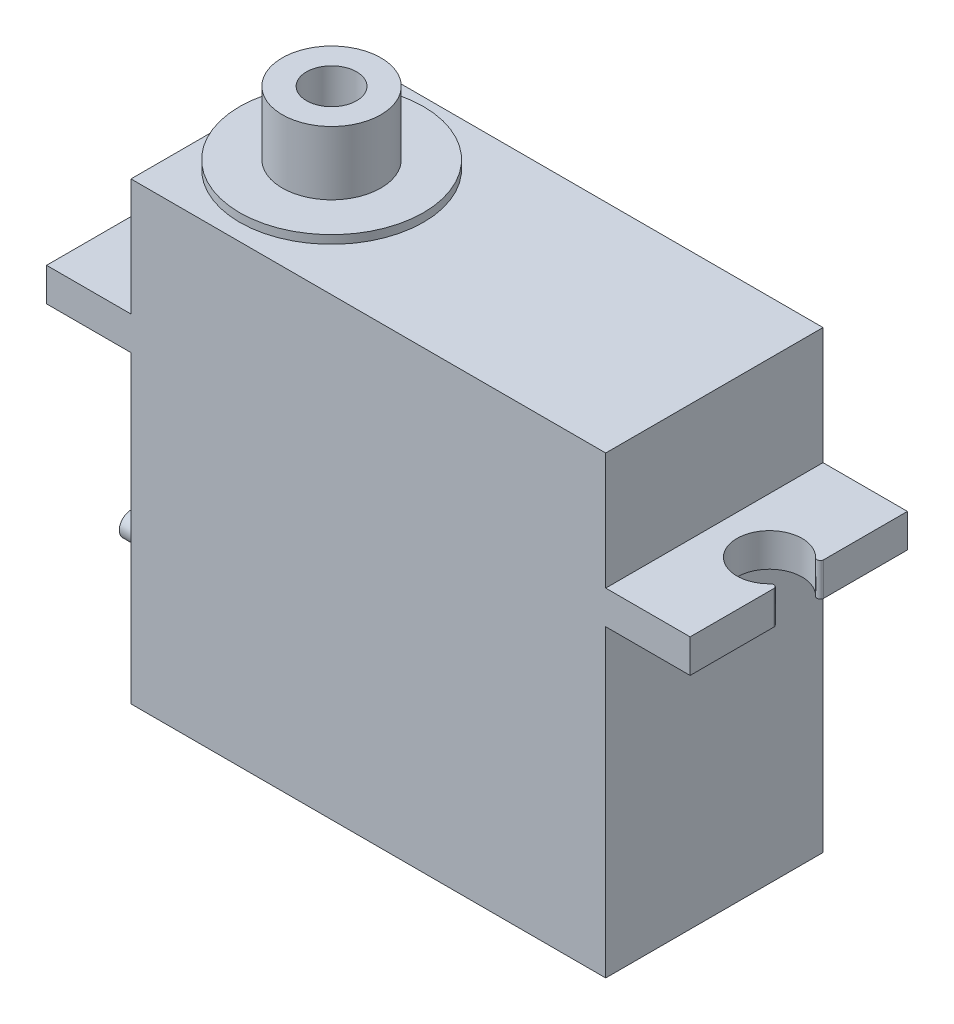
ISO-10303-21;
HEADER;
FILE_DESCRIPTION(('STEP AP214'),'2;1');
FILE_NAME('part.step','',(''),(''),'','','');
FILE_SCHEMA(('AUTOMOTIVE_DESIGN { 1 0 10303 214 1 1 1 1 }'));
ENDSEC;
DATA;
#1=APPLICATION_CONTEXT('core data for automotive mechanical design processes');
#2=APPLICATION_PROTOCOL_DEFINITION('international standard','automotive_design',2000,#1);
#3=PRODUCT_CONTEXT('',#1,'mechanical');
#4=PRODUCT('Part','Part','',(#3));
#5=PRODUCT_RELATED_PRODUCT_CATEGORY('part','',(#4));
#6=PRODUCT_DEFINITION_FORMATION('','',#4);
#7=PRODUCT_DEFINITION_CONTEXT('part definition',#1,'design');
#8=PRODUCT_DEFINITION('design','',#6,#7);
#9=PRODUCT_DEFINITION_SHAPE('','',#8);
#10=(LENGTH_UNIT() NAMED_UNIT(*) SI_UNIT(.MILLI.,.METRE.));
#11=(NAMED_UNIT(*) PLANE_ANGLE_UNIT() SI_UNIT($,.RADIAN.));
#12=(NAMED_UNIT(*) SI_UNIT($,.STERADIAN.) SOLID_ANGLE_UNIT());
#13=UNCERTAINTY_MEASURE_WITH_UNIT(LENGTH_MEASURE(1.E-05),#10,'distance_accuracy_value','');
#14=(GEOMETRIC_REPRESENTATION_CONTEXT(3) GLOBAL_UNCERTAINTY_ASSIGNED_CONTEXT((#13)) GLOBAL_UNIT_ASSIGNED_CONTEXT((#10,
#11,#12)) REPRESENTATION_CONTEXT('',''));
#15=CARTESIAN_POINT('',(0.,0.,0.));
#16=DIRECTION('',(0.,0.,1.));
#17=DIRECTION('',(1.,0.,0.));
#18=AXIS2_PLACEMENT_3D('',#15,#16,#17);
#19=CARTESIAN_POINT('',(-14.2,0.,6.5));
#20=DIRECTION('',(1.,0.,0.));
#21=DIRECTION('',(0.,1.,0.));
#22=AXIS2_PLACEMENT_3D('',#19,#20,#21);
#23=PLANE('',#22);
#24=DIRECTION('',(0.,-1.,0.));
#25=VECTOR('',#24,1.);
#26=CARTESIAN_POINT('',(-14.2,0.,-6.5));
#27=LINE('',#26,#25);
#28=CARTESIAN_POINT('',(-14.2,0.,-6.5));
#29=VERTEX_POINT('',#28);
#30=CARTESIAN_POINT('',(-14.2,-18.2,-6.5));
#31=VERTEX_POINT('',#30);
#32=EDGE_CURVE('E293',#29,#31,#27,.T.);
#33=ORIENTED_EDGE('',*,*,#32,.T.);
#34=DIRECTION('',(0.,0.,-1.));
#35=VECTOR('',#34,1.);
#36=CARTESIAN_POINT('',(-14.2,-18.2,6.5));
#37=LINE('',#36,#35);
#38=CARTESIAN_POINT('',(-14.2,-18.2,6.5));
#39=VERTEX_POINT('',#38);
#40=EDGE_CURVE('E336',#39,#31,#37,.T.);
#41=ORIENTED_EDGE('',*,*,#40,.F.);
#42=DIRECTION('',(0.,-1.,0.));
#43=VECTOR('',#42,1.);
#44=CARTESIAN_POINT('',(-14.2,0.,6.5));
#45=LINE('',#44,#43);
#46=CARTESIAN_POINT('',(-14.2,0.,6.5));
#47=VERTEX_POINT('',#46);
#48=EDGE_CURVE('E265',#47,#39,#45,.T.);
#49=ORIENTED_EDGE('',*,*,#48,.F.);
#50=DIRECTION('',(0.,0.,-1.));
#51=VECTOR('',#50,1.);
#52=CARTESIAN_POINT('',(-14.2,0.,6.5));
#53=LINE('',#52,#51);
#54=EDGE_CURVE('E339',#47,#29,#53,.T.);
#55=ORIENTED_EDGE('',*,*,#54,.T.);
#56=EDGE_LOOP('',(#33,#41,#49,#55));
#57=FACE_BOUND('',#56,.T.);
#58=DIRECTION('',(0.,-1.,0.));
#59=VECTOR('',#58,1.);
#60=CARTESIAN_POINT('',(-14.2,-12.,-3.1));
#61=LINE('',#60,#59);
#62=CARTESIAN_POINT('',(-14.2,-12.,-3.1));
#63=VERTEX_POINT('',#62);
#64=CARTESIAN_POINT('',(-14.2,-15.7,-3.1));
#65=VERTEX_POINT('',#64);
#66=EDGE_CURVE('E226',#63,#65,#61,.T.);
#67=ORIENTED_EDGE('',*,*,#66,.F.);
#68=DIRECTION('',(0.,0.,-1.));
#69=VECTOR('',#68,1.);
#70=CARTESIAN_POINT('',(-14.2,-12.,-3.1));
#71=LINE('',#70,#69);
#72=CARTESIAN_POINT('',(-14.2,-12.,3.1));
#73=VERTEX_POINT('',#72);
#74=EDGE_CURVE('E223',#73,#63,#71,.T.);
#75=ORIENTED_EDGE('',*,*,#74,.F.);
#76=DIRECTION('',(0.,1.,0.));
#77=VECTOR('',#76,1.);
#78=CARTESIAN_POINT('',(-14.2,-12.,3.1));
#79=LINE('',#78,#77);
#80=CARTESIAN_POINT('',(-14.2,-15.7,3.1));
#81=VERTEX_POINT('',#80);
#82=EDGE_CURVE('E59',#81,#73,#79,.T.);
#83=ORIENTED_EDGE('',*,*,#82,.F.);
#84=DIRECTION('',(0.,0.,1.));
#85=VECTOR('',#84,1.);
#86=CARTESIAN_POINT('',(-14.2,-15.7,-3.1));
#87=LINE('',#86,#85);
#88=EDGE_CURVE('E54',#65,#81,#87,.T.);
#89=ORIENTED_EDGE('',*,*,#88,.F.);
#90=EDGE_LOOP('',(#67,#75,#83,#89));
#91=FACE_BOUND('',#90,.T.);
#92=ADVANCED_FACE('F37',(#57,#91),#23,.F.);
#93=CARTESIAN_POINT('',(-19.25,0.,6.5));
#94=DIRECTION('',(1.,0.,0.));
#95=DIRECTION('',(0.,0.,-1.));
#96=AXIS2_PLACEMENT_3D('',#93,#94,#95);
#97=PLANE('',#96);
#98=DIRECTION('',(0.,0.,-1.));
#99=VECTOR('',#98,1.);
#100=CARTESIAN_POINT('',(-19.25,0.,6.5));
#101=LINE('',#100,#99);
#102=CARTESIAN_POINT('',(-19.25,0.,-1.48996644257513));
#103=VERTEX_POINT('',#102);
#104=CARTESIAN_POINT('',(-19.25,0.,-6.5));
#105=VERTEX_POINT('',#104);
#106=EDGE_CURVE('E341',#103,#105,#101,.T.);
#107=ORIENTED_EDGE('',*,*,#106,.F.);
#108=DIRECTION('',(0.,1.,0.));
#109=VECTOR('',#108,1.);
#110=CARTESIAN_POINT('',(-19.25,0.,-1.48996644257513));
#111=LINE('',#110,#109);
#112=CARTESIAN_POINT('',(-19.25,2.,-1.48996644257513));
#113=VERTEX_POINT('',#112);
#114=EDGE_CURVE('E41',#103,#113,#111,.T.);
#115=ORIENTED_EDGE('',*,*,#114,.T.);
#116=DIRECTION('',(0.,0.,-1.));
#117=VECTOR('',#116,1.);
#118=CARTESIAN_POINT('',(-19.25,2.,6.5));
#119=LINE('',#118,#117);
#120=CARTESIAN_POINT('',(-19.25,2.,-6.5));
#121=VERTEX_POINT('',#120);
#122=EDGE_CURVE('E345',#113,#121,#119,.T.);
#123=ORIENTED_EDGE('',*,*,#122,.T.);
#124=DIRECTION('',(0.,-1.,0.));
#125=VECTOR('',#124,1.);
#126=CARTESIAN_POINT('',(-19.25,0.,-6.5));
#127=LINE('',#126,#125);
#128=EDGE_CURVE('E287',#121,#105,#127,.T.);
#129=ORIENTED_EDGE('',*,*,#128,.T.);
#130=EDGE_LOOP('',(#107,#115,#123,#129));
#131=FACE_BOUND('',#130,.T.);
#132=ADVANCED_FACE('F395',(#131),#97,.F.);
#133=CARTESIAN_POINT('',(19.25,0.,6.5));
#134=DIRECTION('',(1.,0.,0.));
#135=DIRECTION('',(0.,0.,-1.));
#136=AXIS2_PLACEMENT_3D('',#133,#134,#135);
#137=PLANE('',#136);
#138=DIRECTION('',(0.,0.,-1.));
#139=VECTOR('',#138,1.);
#140=CARTESIAN_POINT('',(19.25,2.,6.5));
#141=LINE('',#140,#139);
#142=CARTESIAN_POINT('',(19.25,2.,-1.48996644257513));
#143=VERTEX_POINT('',#142);
#144=CARTESIAN_POINT('',(19.25,2.,-6.5));
#145=VERTEX_POINT('',#144);
#146=EDGE_CURVE('E324',#143,#145,#141,.T.);
#147=ORIENTED_EDGE('',*,*,#146,.F.);
#148=DIRECTION('',(0.,-1.,0.));
#149=VECTOR('',#148,1.);
#150=CARTESIAN_POINT('',(19.25,0.,-1.48996644257514));
#151=LINE('',#150,#149);
#152=CARTESIAN_POINT('',(19.25,0.,-1.48996644257513));
#153=VERTEX_POINT('',#152);
#154=EDGE_CURVE('E371',#143,#153,#151,.T.);
#155=ORIENTED_EDGE('',*,*,#154,.T.);
#156=DIRECTION('',(0.,0.,-1.));
#157=VECTOR('',#156,1.);
#158=CARTESIAN_POINT('',(19.25,0.,6.5));
#159=LINE('',#158,#157);
#160=CARTESIAN_POINT('',(19.25,0.,-6.5));
#161=VERTEX_POINT('',#160);
#162=EDGE_CURVE('E328',#153,#161,#159,.T.);
#163=ORIENTED_EDGE('',*,*,#162,.T.);
#164=DIRECTION('',(0.,-1.,0.));
#165=VECTOR('',#164,1.);
#166=CARTESIAN_POINT('',(19.25,0.,-6.5));
#167=LINE('',#166,#165);
#168=EDGE_CURVE('E305',#145,#161,#167,.T.);
#169=ORIENTED_EDGE('',*,*,#168,.F.);
#170=EDGE_LOOP('',(#147,#155,#163,#169));
#171=FACE_BOUND('',#170,.T.);
#172=ADVANCED_FACE('F451',(#171),#137,.T.);
#173=CARTESIAN_POINT('',(0.,2.,6.5));
#174=DIRECTION('',(0.,-1.,0.));
#175=DIRECTION('',(1.,0.,0.));
#176=AXIS2_PLACEMENT_3D('',#173,#174,#175);
#177=PLANE('',#176);
#178=CARTESIAN_POINT('',(-17.5,2.,0.));
#179=DIRECTION('',(0.,1.,0.));
#180=DIRECTION('',(0.,0.,1.));
#181=AXIS2_PLACEMENT_3D('',#178,#179,#180);
#182=CIRCLE('',#181,1.95);
#183=CARTESIAN_POINT('',(-18.9058139534884,2.,1.35136491303326));
#184=VERTEX_POINT('',#183);
#185=CARTESIAN_POINT('',(-18.9058139534884,2.,-1.35136491303326));
#186=VERTEX_POINT('',#185);
#187=EDGE_CURVE('E247',#184,#186,#182,.T.);
#188=ORIENTED_EDGE('',*,*,#187,.F.);
#189=CARTESIAN_POINT('',(-19.05,2.,1.48996644257514));
#190=DIRECTION('',(0.,-1.,0.));
#191=DIRECTION('',(1.,0.,0.));
#192=AXIS2_PLACEMENT_3D('',#189,#190,#191);
#193=CIRCLE('',#192,0.2);
#194=CARTESIAN_POINT('',(-19.25,2.,1.48996644257514));
#195=VERTEX_POINT('',#194);
#196=EDGE_CURVE('E385',#184,#195,#193,.F.);
#197=ORIENTED_EDGE('',*,*,#196,.T.);
#198=CARTESIAN_POINT('',(-19.25,2.,6.5));
#199=VERTEX_POINT('',#198);
#200=EDGE_CURVE('E346',#199,#195,#119,.T.);
#201=ORIENTED_EDGE('',*,*,#200,.F.);
#202=DIRECTION('',(-1.,0.,0.));
#203=VECTOR('',#202,1.);
#204=CARTESIAN_POINT('',(0.,2.,6.5));
#205=LINE('',#204,#203);
#206=CARTESIAN_POINT('',(-14.2,2.,6.5));
#207=VERTEX_POINT('',#206);
#208=EDGE_CURVE('E256',#207,#199,#205,.T.);
#209=ORIENTED_EDGE('',*,*,#208,.F.);
#210=DIRECTION('',(0.,0.,-1.));
#211=VECTOR('',#210,1.);
#212=CARTESIAN_POINT('',(-14.2,2.,6.5));
#213=LINE('',#212,#211);
#214=CARTESIAN_POINT('',(-14.2,2.,-6.5));
#215=VERTEX_POINT('',#214);
#216=EDGE_CURVE('E314',#207,#215,#213,.T.);
#217=ORIENTED_EDGE('',*,*,#216,.T.);
#218=DIRECTION('',(-1.,0.,0.));
#219=VECTOR('',#218,1.);
#220=CARTESIAN_POINT('',(0.,2.,-6.5));
#221=LINE('',#220,#219);
#222=EDGE_CURVE('E255',#215,#121,#221,.T.);
#223=ORIENTED_EDGE('',*,*,#222,.T.);
#224=ORIENTED_EDGE('',*,*,#122,.F.);
#225=CARTESIAN_POINT('',(-19.05,2.,-1.48996644257514));
#226=DIRECTION('',(0.,-1.,0.));
#227=DIRECTION('',(1.,0.,0.));
#228=AXIS2_PLACEMENT_3D('',#225,#226,#227);
#229=CIRCLE('',#228,0.2);
#230=EDGE_CURVE('E384',#113,#186,#229,.F.);
#231=ORIENTED_EDGE('',*,*,#230,.T.);
#232=EDGE_LOOP('',(#188,#197,#201,#209,#217,#223,#224,#231));
#233=FACE_BOUND('',#232,.T.);
#234=ADVANCED_FACE('F399',(#233),#177,.F.);
#235=ORIENTED_EDGE('',*,*,#200,.T.);
#236=DIRECTION('',(0.,1.,0.));
#237=VECTOR('',#236,1.);
#238=CARTESIAN_POINT('',(-19.25,0.,1.48996644257514));
#239=LINE('',#238,#237);
#240=CARTESIAN_POINT('',(-19.25,0.,1.48996644257514));
#241=VERTEX_POINT('',#240);
#242=EDGE_CURVE('E373',#195,#241,#239,.F.);
#243=ORIENTED_EDGE('',*,*,#242,.T.);
#244=CARTESIAN_POINT('',(-19.25,0.,6.5));
#245=VERTEX_POINT('',#244);
#246=EDGE_CURVE('E342',#245,#241,#101,.T.);
#247=ORIENTED_EDGE('',*,*,#246,.F.);
#248=DIRECTION('',(0.,-1.,0.));
#249=VECTOR('',#248,1.);
#250=CARTESIAN_POINT('',(-19.25,0.,6.5));
#251=LINE('',#250,#249);
#252=EDGE_CURVE('E259',#199,#245,#251,.T.);
#253=ORIENTED_EDGE('',*,*,#252,.F.);
#254=EDGE_LOOP('',(#235,#243,#247,#253));
#255=FACE_BOUND('',#254,.T.);
#256=ADVANCED_FACE('F423',(#255),#97,.F.);
#257=CARTESIAN_POINT('',(0.,0.,6.5));
#258=DIRECTION('',(0.,-1.,0.));
#259=DIRECTION('',(1.,0.,0.));
#260=AXIS2_PLACEMENT_3D('',#257,#258,#259);
#261=PLANE('',#260);
#262=ORIENTED_EDGE('',*,*,#246,.T.);
#263=CARTESIAN_POINT('',(-19.05,0.,1.48996644257514));
#264=DIRECTION('',(0.,-1.,0.));
#265=DIRECTION('',(1.,0.,0.));
#266=AXIS2_PLACEMENT_3D('',#263,#264,#265);
#267=CIRCLE('',#266,0.2);
#268=CARTESIAN_POINT('',(-18.9058139534884,0.,1.35136491303326));
#269=VERTEX_POINT('',#268);
#270=EDGE_CURVE('E378',#241,#269,#267,.T.);
#271=ORIENTED_EDGE('',*,*,#270,.T.);
#272=CARTESIAN_POINT('',(-17.5,0.,0.));
#273=DIRECTION('',(0.,-1.,0.));
#274=DIRECTION('',(1.,0.,0.));
#275=AXIS2_PLACEMENT_3D('',#272,#273,#274);
#276=CIRCLE('',#275,1.95);
#277=CARTESIAN_POINT('',(-18.9058139534884,0.,-1.35136491303326));
#278=VERTEX_POINT('',#277);
#279=EDGE_CURVE('E352',#278,#269,#276,.T.);
#280=ORIENTED_EDGE('',*,*,#279,.F.);
#281=CARTESIAN_POINT('',(-19.05,0.,-1.48996644257514));
#282=DIRECTION('',(0.,-1.,0.));
#283=DIRECTION('',(1.,0.,0.));
#284=AXIS2_PLACEMENT_3D('',#281,#282,#283);
#285=CIRCLE('',#284,0.2);
#286=EDGE_CURVE('E376',#278,#103,#285,.T.);
#287=ORIENTED_EDGE('',*,*,#286,.T.);
#288=ORIENTED_EDGE('',*,*,#106,.T.);
#289=DIRECTION('',(-1.,0.,0.));
#290=VECTOR('',#289,1.);
#291=CARTESIAN_POINT('',(0.,0.,-6.5));
#292=LINE('',#291,#290);
#293=EDGE_CURVE('E290',#29,#105,#292,.T.);
#294=ORIENTED_EDGE('',*,*,#293,.F.);
#295=ORIENTED_EDGE('',*,*,#54,.F.);
#296=DIRECTION('',(-1.,0.,0.));
#297=VECTOR('',#296,1.);
#298=CARTESIAN_POINT('',(0.,0.,6.5));
#299=LINE('',#298,#297);
#300=EDGE_CURVE('E262',#47,#245,#299,.T.);
#301=ORIENTED_EDGE('',*,*,#300,.T.);
#302=EDGE_LOOP('',(#262,#271,#280,#287,#288,#294,#295,#301));
#303=FACE_BOUND('',#302,.T.);
#304=ADVANCED_FACE('F411',(#303),#261,.T.);
#305=CARTESIAN_POINT('',(0.,-18.2,6.5));
#306=DIRECTION('',(0.,1.,0.));
#307=DIRECTION('',(-1.,0.,0.));
#308=AXIS2_PLACEMENT_3D('',#305,#306,#307);
#309=PLANE('',#308);
#310=DIRECTION('',(1.,0.,0.));
#311=VECTOR('',#310,1.);
#312=CARTESIAN_POINT('',(0.,-18.2,-6.5));
#313=LINE('',#312,#311);
#314=CARTESIAN_POINT('',(14.2,-18.2,-6.5));
#315=VERTEX_POINT('',#314);
#316=EDGE_CURVE('E295',#31,#315,#313,.T.);
#317=ORIENTED_EDGE('',*,*,#316,.T.);
#318=DIRECTION('',(0.,0.,-1.));
#319=VECTOR('',#318,1.);
#320=CARTESIAN_POINT('',(14.2,-18.2,6.5));
#321=LINE('',#320,#319);
#322=CARTESIAN_POINT('',(14.2,-18.2,6.5));
#323=VERTEX_POINT('',#322);
#324=EDGE_CURVE('E334',#323,#315,#321,.T.);
#325=ORIENTED_EDGE('',*,*,#324,.F.);
#326=DIRECTION('',(1.,0.,0.));
#327=VECTOR('',#326,1.);
#328=CARTESIAN_POINT('',(0.,-18.2,6.5));
#329=LINE('',#328,#327);
#330=EDGE_CURVE('E267',#39,#323,#329,.T.);
#331=ORIENTED_EDGE('',*,*,#330,.F.);
#332=ORIENTED_EDGE('',*,*,#40,.T.);
#333=EDGE_LOOP('',(#317,#325,#331,#332));
#334=FACE_BOUND('',#333,.T.);
#335=ADVANCED_FACE('F463',(#334),#309,.F.);
#336=CARTESIAN_POINT('',(14.2,0.,6.5));
#337=DIRECTION('',(1.,0.,0.));
#338=DIRECTION('',(0.,1.,0.));
#339=AXIS2_PLACEMENT_3D('',#336,#337,#338);
#340=PLANE('',#339);
#341=DIRECTION('',(0.,-1.,0.));
#342=VECTOR('',#341,1.);
#343=CARTESIAN_POINT('',(14.2,0.,-6.5));
#344=LINE('',#343,#342);
#345=CARTESIAN_POINT('',(14.2,0.,-6.5));
#346=VERTEX_POINT('',#345);
#347=EDGE_CURVE('E298',#346,#315,#344,.T.);
#348=ORIENTED_EDGE('',*,*,#347,.F.);
#349=DIRECTION('',(0.,0.,-1.));
#350=VECTOR('',#349,1.);
#351=CARTESIAN_POINT('',(14.2,0.,6.5));
#352=LINE('',#351,#350);
#353=CARTESIAN_POINT('',(14.2,0.,6.5));
#354=VERTEX_POINT('',#353);
#355=EDGE_CURVE('E332',#354,#346,#352,.T.);
#356=ORIENTED_EDGE('',*,*,#355,.F.);
#357=DIRECTION('',(0.,-1.,0.));
#358=VECTOR('',#357,1.);
#359=CARTESIAN_POINT('',(14.2,0.,6.5));
#360=LINE('',#359,#358);
#361=EDGE_CURVE('E270',#354,#323,#360,.T.);
#362=ORIENTED_EDGE('',*,*,#361,.T.);
#363=ORIENTED_EDGE('',*,*,#324,.T.);
#364=EDGE_LOOP('',(#348,#356,#362,#363));
#365=FACE_BOUND('',#364,.T.);
#366=ADVANCED_FACE('F457',(#365),#340,.T.);
#367=CARTESIAN_POINT('',(0.,0.,6.5));
#368=DIRECTION('',(0.,1.,0.));
#369=DIRECTION('',(-1.,0.,0.));
#370=AXIS2_PLACEMENT_3D('',#367,#368,#369);
#371=PLANE('',#370);
#372=CARTESIAN_POINT('',(17.5,0.,0.));
#373=DIRECTION('',(0.,1.,0.));
#374=DIRECTION('',(-1.,0.,0.));
#375=AXIS2_PLACEMENT_3D('',#372,#373,#374);
#376=CIRCLE('',#375,1.95);
#377=CARTESIAN_POINT('',(18.9058139534884,0.,-1.35136491303326));
#378=VERTEX_POINT('',#377);
#379=CARTESIAN_POINT('',(18.9058139534884,0.,1.35136491303326));
#380=VERTEX_POINT('',#379);
#381=EDGE_CURVE('E349',#378,#380,#376,.T.);
#382=ORIENTED_EDGE('',*,*,#381,.T.);
#383=CARTESIAN_POINT('',(19.05,0.,1.48996644257514));
#384=DIRECTION('',(0.,1.,0.));
#385=DIRECTION('',(-1.,0.,0.));
#386=AXIS2_PLACEMENT_3D('',#383,#384,#385);
#387=CIRCLE('',#386,0.2);
#388=CARTESIAN_POINT('',(19.25,0.,1.48996644257514));
#389=VERTEX_POINT('',#388);
#390=EDGE_CURVE('E363',#380,#389,#387,.F.);
#391=ORIENTED_EDGE('',*,*,#390,.T.);
#392=CARTESIAN_POINT('',(19.25,0.,6.5));
#393=VERTEX_POINT('',#392);
#394=EDGE_CURVE('E329',#393,#389,#159,.T.);
#395=ORIENTED_EDGE('',*,*,#394,.F.);
#396=DIRECTION('',(1.,0.,0.));
#397=VECTOR('',#396,1.);
#398=CARTESIAN_POINT('',(0.,0.,6.5));
#399=LINE('',#398,#397);
#400=EDGE_CURVE('E273',#354,#393,#399,.T.);
#401=ORIENTED_EDGE('',*,*,#400,.F.);
#402=ORIENTED_EDGE('',*,*,#355,.T.);
#403=DIRECTION('',(1.,0.,0.));
#404=VECTOR('',#403,1.);
#405=CARTESIAN_POINT('',(0.,0.,-6.5));
#406=LINE('',#405,#404);
#407=EDGE_CURVE('E301',#346,#161,#406,.T.);
#408=ORIENTED_EDGE('',*,*,#407,.T.);
#409=ORIENTED_EDGE('',*,*,#162,.F.);
#410=CARTESIAN_POINT('',(19.05,0.,-1.48996644257514));
#411=DIRECTION('',(0.,1.,0.));
#412=DIRECTION('',(-1.,0.,0.));
#413=AXIS2_PLACEMENT_3D('',#410,#411,#412);
#414=CIRCLE('',#413,0.2);
#415=EDGE_CURVE('E361',#153,#378,#414,.F.);
#416=ORIENTED_EDGE('',*,*,#415,.T.);
#417=EDGE_LOOP('',(#382,#391,#395,#401,#402,#408,#409,#416));
#418=FACE_BOUND('',#417,.T.);
#419=ADVANCED_FACE('F582',(#418),#371,.F.);
#420=ORIENTED_EDGE('',*,*,#394,.T.);
#421=DIRECTION('',(0.,-1.,0.));
#422=VECTOR('',#421,1.);
#423=CARTESIAN_POINT('',(19.25,2.,1.48996644257514));
#424=LINE('',#423,#422);
#425=CARTESIAN_POINT('',(19.25,2.,1.48996644257514));
#426=VERTEX_POINT('',#425);
#427=EDGE_CURVE('E365',#389,#426,#424,.F.);
#428=ORIENTED_EDGE('',*,*,#427,.T.);
#429=CARTESIAN_POINT('',(19.25,2.,6.5));
#430=VERTEX_POINT('',#429);
#431=EDGE_CURVE('E325',#430,#426,#141,.T.);
#432=ORIENTED_EDGE('',*,*,#431,.F.);
#433=DIRECTION('',(0.,-1.,0.));
#434=VECTOR('',#433,1.);
#435=CARTESIAN_POINT('',(19.25,0.,6.5));
#436=LINE('',#435,#434);
#437=EDGE_CURVE('E276',#430,#393,#436,.T.);
#438=ORIENTED_EDGE('',*,*,#437,.T.);
#439=EDGE_LOOP('',(#420,#428,#432,#438));
#440=FACE_BOUND('',#439,.T.);
#441=ADVANCED_FACE('F579',(#440),#137,.T.);
#442=CARTESIAN_POINT('',(0.,2.,6.5));
#443=DIRECTION('',(0.,1.,0.));
#444=DIRECTION('',(-1.,0.,0.));
#445=AXIS2_PLACEMENT_3D('',#442,#443,#444);
#446=PLANE('',#445);
#447=ORIENTED_EDGE('',*,*,#431,.T.);
#448=CARTESIAN_POINT('',(19.05,2.,1.48996644257514));
#449=DIRECTION('',(0.,1.,0.));
#450=DIRECTION('',(-1.,0.,0.));
#451=AXIS2_PLACEMENT_3D('',#448,#449,#450);
#452=CIRCLE('',#451,0.2);
#453=CARTESIAN_POINT('',(18.9058139534884,2.,1.35136491303326));
#454=VERTEX_POINT('',#453);
#455=EDGE_CURVE('E369',#426,#454,#452,.T.);
#456=ORIENTED_EDGE('',*,*,#455,.T.);
#457=CARTESIAN_POINT('',(17.5,2.,0.));
#458=DIRECTION('',(0.,1.,0.));
#459=DIRECTION('',(0.,0.,1.));
#460=AXIS2_PLACEMENT_3D('',#457,#458,#459);
#461=CIRCLE('',#460,1.95);
#462=CARTESIAN_POINT('',(18.9058139534884,2.,-1.35136491303326));
#463=VERTEX_POINT('',#462);
#464=EDGE_CURVE('E252',#463,#454,#461,.T.);
#465=ORIENTED_EDGE('',*,*,#464,.F.);
#466=CARTESIAN_POINT('',(19.05,2.,-1.48996644257514));
#467=DIRECTION('',(0.,1.,0.));
#468=DIRECTION('',(-1.,0.,0.));
#469=AXIS2_PLACEMENT_3D('',#466,#467,#468);
#470=CIRCLE('',#469,0.2);
#471=EDGE_CURVE('E367',#463,#143,#470,.T.);
#472=ORIENTED_EDGE('',*,*,#471,.T.);
#473=ORIENTED_EDGE('',*,*,#146,.T.);
#474=DIRECTION('',(1.,0.,0.));
#475=VECTOR('',#474,1.);
#476=CARTESIAN_POINT('',(0.,2.,-6.5));
#477=LINE('',#476,#475);
#478=CARTESIAN_POINT('',(14.2,2.,-6.5));
#479=VERTEX_POINT('',#478);
#480=EDGE_CURVE('E308',#479,#145,#477,.T.);
#481=ORIENTED_EDGE('',*,*,#480,.F.);
#482=DIRECTION('',(0.,0.,-1.));
#483=VECTOR('',#482,1.);
#484=CARTESIAN_POINT('',(14.2,2.,6.5));
#485=LINE('',#484,#483);
#486=CARTESIAN_POINT('',(14.2,2.,6.5));
#487=VERTEX_POINT('',#486);
#488=EDGE_CURVE('E322',#487,#479,#485,.T.);
#489=ORIENTED_EDGE('',*,*,#488,.F.);
#490=DIRECTION('',(1.,0.,0.));
#491=VECTOR('',#490,1.);
#492=CARTESIAN_POINT('',(0.,2.,6.5));
#493=LINE('',#492,#491);
#494=EDGE_CURVE('E279',#487,#430,#493,.T.);
#495=ORIENTED_EDGE('',*,*,#494,.T.);
#496=EDGE_LOOP('',(#447,#456,#465,#472,#473,#481,#489,#495));
#497=FACE_BOUND('',#496,.T.);
#498=ADVANCED_FACE('F445',(#497),#446,.T.);
#499=CARTESIAN_POINT('',(14.2,9.,-6.5));
#500=VERTEX_POINT('',#499);
#501=EDGE_CURVE('E302',#500,#479,#344,.T.);
#502=ORIENTED_EDGE('',*,*,#501,.F.);
#503=DIRECTION('',(0.,0.,-1.));
#504=VECTOR('',#503,1.);
#505=CARTESIAN_POINT('',(14.2,9.,6.5));
#506=LINE('',#505,#504);
#507=CARTESIAN_POINT('',(14.2,9.,6.5));
#508=VERTEX_POINT('',#507);
#509=EDGE_CURVE('E320',#508,#500,#506,.T.);
#510=ORIENTED_EDGE('',*,*,#509,.F.);
#511=EDGE_CURVE('E274',#508,#487,#360,.T.);
#512=ORIENTED_EDGE('',*,*,#511,.T.);
#513=ORIENTED_EDGE('',*,*,#488,.T.);
#514=EDGE_LOOP('',(#502,#510,#512,#513));
#515=FACE_BOUND('',#514,.T.);
#516=ADVANCED_FACE('F441',(#515),#340,.T.);
#517=CARTESIAN_POINT('',(0.,9.,6.5));
#518=DIRECTION('',(0.,1.,0.));
#519=DIRECTION('',(0.,0.,1.));
#520=AXIS2_PLACEMENT_3D('',#517,#518,#519);
#521=PLANE('',#520);
#522=DIRECTION('',(0.,0.,-1.));
#523=VECTOR('',#522,1.);
#524=CARTESIAN_POINT('',(-14.2,9.,6.5));
#525=LINE('',#524,#523);
#526=CARTESIAN_POINT('',(-14.2,9.,0.));
#527=VERTEX_POINT('',#526);
#528=CARTESIAN_POINT('',(-14.2,9.,-6.5));
#529=VERTEX_POINT('',#528);
#530=EDGE_CURVE('E317',#527,#529,#525,.T.);
#531=ORIENTED_EDGE('',*,*,#530,.F.);
#532=CARTESIAN_POINT('',(-8.7,9.,0.));
#533=DIRECTION('',(0.,1.,0.));
#534=DIRECTION('',(-1.,0.,0.));
#535=AXIS2_PLACEMENT_3D('',#532,#533,#534);
#536=CIRCLE('',#535,5.5);
#537=EDGE_CURVE('E241',#527,#527,#536,.T.);
#538=ORIENTED_EDGE('',*,*,#537,.F.);
#539=CARTESIAN_POINT('',(-14.2,9.,6.5));
#540=VERTEX_POINT('',#539);
#541=EDGE_CURVE('E318',#540,#527,#525,.T.);
#542=ORIENTED_EDGE('',*,*,#541,.F.);
#543=DIRECTION('',(1.,0.,0.));
#544=VECTOR('',#543,1.);
#545=CARTESIAN_POINT('',(0.,9.,6.5));
#546=LINE('',#545,#544);
#547=EDGE_CURVE('E282',#540,#508,#546,.T.);
#548=ORIENTED_EDGE('',*,*,#547,.T.);
#549=ORIENTED_EDGE('',*,*,#509,.T.);
#550=DIRECTION('',(1.,0.,0.));
#551=VECTOR('',#550,1.);
#552=CARTESIAN_POINT('',(0.,9.,-6.5));
#553=LINE('',#552,#551);
#554=EDGE_CURVE('E311',#529,#500,#553,.T.);
#555=ORIENTED_EDGE('',*,*,#554,.F.);
#556=EDGE_LOOP('',(#531,#538,#542,#548,#549,#555));
#557=FACE_BOUND('',#556,.T.);
#558=ADVANCED_FACE('F436',(#557),#521,.T.);
#559=EDGE_CURVE('E260',#529,#215,#27,.T.);
#560=ORIENTED_EDGE('',*,*,#559,.T.);
#561=ORIENTED_EDGE('',*,*,#216,.F.);
#562=EDGE_CURVE('E268',#540,#207,#45,.T.);
#563=ORIENTED_EDGE('',*,*,#562,.F.);
#564=ORIENTED_EDGE('',*,*,#541,.T.);
#565=ORIENTED_EDGE('',*,*,#530,.T.);
#566=EDGE_LOOP('',(#560,#561,#563,#564,#565));
#567=FACE_BOUND('',#566,.T.);
#568=ADVANCED_FACE('F432',(#567),#23,.F.);
#569=CARTESIAN_POINT('',(0.,0.,6.5));
#570=DIRECTION('',(0.,0.,1.));
#571=DIRECTION('',(1.,0.,0.));
#572=AXIS2_PLACEMENT_3D('',#569,#570,#571);
#573=PLANE('',#572);
#574=ORIENTED_EDGE('',*,*,#208,.T.);
#575=ORIENTED_EDGE('',*,*,#252,.T.);
#576=ORIENTED_EDGE('',*,*,#300,.F.);
#577=ORIENTED_EDGE('',*,*,#48,.T.);
#578=ORIENTED_EDGE('',*,*,#330,.T.);
#579=ORIENTED_EDGE('',*,*,#361,.F.);
#580=ORIENTED_EDGE('',*,*,#400,.T.);
#581=ORIENTED_EDGE('',*,*,#437,.F.);
#582=ORIENTED_EDGE('',*,*,#494,.F.);
#583=ORIENTED_EDGE('',*,*,#511,.F.);
#584=ORIENTED_EDGE('',*,*,#547,.F.);
#585=ORIENTED_EDGE('',*,*,#562,.T.);
#586=EDGE_LOOP('',(#574,#575,#576,#577,#578,#579,#580,#581,#582,#583,#584,#585));
#587=FACE_BOUND('',#586,.T.);
#588=ADVANCED_FACE('F426',(#587),#573,.T.);
#589=CARTESIAN_POINT('',(0.,0.,-6.5));
#590=DIRECTION('',(0.,0.,1.));
#591=DIRECTION('',(1.,0.,0.));
#592=AXIS2_PLACEMENT_3D('',#589,#590,#591);
#593=PLANE('',#592);
#594=ORIENTED_EDGE('',*,*,#222,.F.);
#595=ORIENTED_EDGE('',*,*,#559,.F.);
#596=ORIENTED_EDGE('',*,*,#554,.T.);
#597=ORIENTED_EDGE('',*,*,#501,.T.);
#598=ORIENTED_EDGE('',*,*,#480,.T.);
#599=ORIENTED_EDGE('',*,*,#168,.T.);
#600=ORIENTED_EDGE('',*,*,#407,.F.);
#601=ORIENTED_EDGE('',*,*,#347,.T.);
#602=ORIENTED_EDGE('',*,*,#316,.F.);
#603=ORIENTED_EDGE('',*,*,#32,.F.);
#604=ORIENTED_EDGE('',*,*,#293,.T.);
#605=ORIENTED_EDGE('',*,*,#128,.F.);
#606=EDGE_LOOP('',(#594,#595,#596,#597,#598,#599,#600,#601,#602,#603,#604,#605));
#607=FACE_BOUND('',#606,.T.);
#608=ADVANCED_FACE('F405',(#607),#593,.F.);
#609=CARTESIAN_POINT('',(17.5,2.,0.));
#610=DIRECTION('',(0.,1.,0.));
#611=DIRECTION('',(0.,0.,1.));
#612=AXIS2_PLACEMENT_3D('',#609,#610,#611);
#613=CYLINDRICAL_SURFACE('',#612,1.95);
#614=ORIENTED_EDGE('',*,*,#464,.T.);
#615=DIRECTION('',(0.,1.,0.));
#616=VECTOR('',#615,1.);
#617=CARTESIAN_POINT('',(18.9058139534884,2.,1.35136491303326));
#618=LINE('',#617,#616);
#619=EDGE_CURVE('E358',#454,#380,#618,.F.);
#620=ORIENTED_EDGE('',*,*,#619,.T.);
#621=ORIENTED_EDGE('',*,*,#381,.F.);
#622=DIRECTION('',(0.,1.,0.));
#623=VECTOR('',#622,1.);
#624=CARTESIAN_POINT('',(18.9058139534884,2.,-1.35136491303326));
#625=LINE('',#624,#623);
#626=EDGE_CURVE('E355',#378,#463,#625,.T.);
#627=ORIENTED_EDGE('',*,*,#626,.T.);
#628=EDGE_LOOP('',(#614,#620,#621,#627));
#629=FACE_BOUND('',#628,.T.);
#630=ADVANCED_FACE('F564',(#629),#613,.F.);
#631=CARTESIAN_POINT('',(-17.5,2.,0.));
#632=DIRECTION('',(0.,1.,0.));
#633=DIRECTION('',(0.,0.,1.));
#634=AXIS2_PLACEMENT_3D('',#631,#632,#633);
#635=CYLINDRICAL_SURFACE('',#634,1.95);
#636=ORIENTED_EDGE('',*,*,#279,.T.);
#637=DIRECTION('',(0.,1.,0.));
#638=VECTOR('',#637,1.);
#639=CARTESIAN_POINT('',(-18.9058139534884,2.,1.35136491303326));
#640=LINE('',#639,#638);
#641=EDGE_CURVE('E382',#269,#184,#640,.T.);
#642=ORIENTED_EDGE('',*,*,#641,.T.);
#643=ORIENTED_EDGE('',*,*,#187,.T.);
#644=DIRECTION('',(0.,1.,0.));
#645=VECTOR('',#644,1.);
#646=CARTESIAN_POINT('',(-18.9058139534884,2.,-1.35136491303326));
#647=LINE('',#646,#645);
#648=EDGE_CURVE('E380',#186,#278,#647,.F.);
#649=ORIENTED_EDGE('',*,*,#648,.T.);
#650=EDGE_LOOP('',(#636,#642,#643,#649));
#651=FACE_BOUND('',#650,.T.);
#652=ADVANCED_FACE('F416',(#651),#635,.F.);
#653=CARTESIAN_POINT('',(19.05,2.,1.48996644257514));
#654=DIRECTION('',(0.,1.,0.));
#655=DIRECTION('',(0.,0.,1.));
#656=AXIS2_PLACEMENT_3D('',#653,#654,#655);
#657=CYLINDRICAL_SURFACE('',#656,0.2);
#658=ORIENTED_EDGE('',*,*,#455,.F.);
#659=ORIENTED_EDGE('',*,*,#427,.F.);
#660=ORIENTED_EDGE('',*,*,#390,.F.);
#661=ORIENTED_EDGE('',*,*,#619,.F.);
#662=EDGE_LOOP('',(#658,#659,#660,#661));
#663=FACE_BOUND('',#662,.T.);
#664=ADVANCED_FACE('F563',(#663),#657,.T.);
#665=CARTESIAN_POINT('',(19.05,2.,-1.48996644257514));
#666=DIRECTION('',(0.,1.,0.));
#667=DIRECTION('',(0.,0.,1.));
#668=AXIS2_PLACEMENT_3D('',#665,#666,#667);
#669=CYLINDRICAL_SURFACE('',#668,0.2);
#670=ORIENTED_EDGE('',*,*,#415,.F.);
#671=ORIENTED_EDGE('',*,*,#154,.F.);
#672=ORIENTED_EDGE('',*,*,#471,.F.);
#673=ORIENTED_EDGE('',*,*,#626,.F.);
#674=EDGE_LOOP('',(#670,#671,#672,#673));
#675=FACE_BOUND('',#674,.T.);
#676=ADVANCED_FACE('F596',(#675),#669,.T.);
#677=CARTESIAN_POINT('',(-19.05,2.,1.48996644257514));
#678=DIRECTION('',(0.,1.,0.));
#679=DIRECTION('',(0.,0.,1.));
#680=AXIS2_PLACEMENT_3D('',#677,#678,#679);
#681=CYLINDRICAL_SURFACE('',#680,0.2);
#682=ORIENTED_EDGE('',*,*,#196,.F.);
#683=ORIENTED_EDGE('',*,*,#641,.F.);
#684=ORIENTED_EDGE('',*,*,#270,.F.);
#685=ORIENTED_EDGE('',*,*,#242,.F.);
#686=EDGE_LOOP('',(#682,#683,#684,#685));
#687=FACE_BOUND('',#686,.T.);
#688=ADVANCED_FACE('F420',(#687),#681,.T.);
#689=CARTESIAN_POINT('',(-19.05,2.,-1.48996644257514));
#690=DIRECTION('',(0.,1.,0.));
#691=DIRECTION('',(0.,0.,1.));
#692=AXIS2_PLACEMENT_3D('',#689,#690,#691);
#693=CYLINDRICAL_SURFACE('',#692,0.2);
#694=ORIENTED_EDGE('',*,*,#286,.F.);
#695=ORIENTED_EDGE('',*,*,#648,.F.);
#696=ORIENTED_EDGE('',*,*,#230,.F.);
#697=ORIENTED_EDGE('',*,*,#114,.F.);
#698=EDGE_LOOP('',(#694,#695,#696,#697));
#699=FACE_BOUND('',#698,.T.);
#700=ADVANCED_FACE('F39',(#699),#693,.T.);
#701=CARTESIAN_POINT('',(-8.7,9.5,0.));
#702=DIRECTION('',(0.,-1.,0.));
#703=DIRECTION('',(1.,0.,0.));
#704=AXIS2_PLACEMENT_3D('',#701,#702,#703);
#705=CYLINDRICAL_SURFACE('',#704,5.5);
#706=CARTESIAN_POINT('',(-8.7,9.5,0.));
#707=DIRECTION('',(0.,1.,0.));
#708=DIRECTION('',(-1.,0.,0.));
#709=AXIS2_PLACEMENT_3D('',#706,#707,#708);
#710=CIRCLE('',#709,5.5);
#711=CARTESIAN_POINT('',(-14.2,9.5,0.));
#712=VERTEX_POINT('',#711);
#713=EDGE_CURVE('E244',#712,#712,#710,.T.);
#714=ORIENTED_EDGE('',*,*,#713,.F.);
#715=EDGE_LOOP('',(#714));
#716=FACE_BOUND('',#715,.T.);
#717=ORIENTED_EDGE('',*,*,#537,.T.);
#718=EDGE_LOOP('',(#717));
#719=FACE_BOUND('',#718,.T.);
#720=ADVANCED_FACE('F556',(#716,#719),#705,.T.);
#721=CARTESIAN_POINT('',(-8.7,9.5,0.));
#722=DIRECTION('',(0.,1.,0.));
#723=DIRECTION('',(-1.,0.,0.));
#724=AXIS2_PLACEMENT_3D('',#721,#722,#723);
#725=PLANE('',#724);
#726=CARTESIAN_POINT('',(-8.7,9.5,0.));
#727=DIRECTION('',(0.,1.,0.));
#728=DIRECTION('',(-1.,0.,0.));
#729=AXIS2_PLACEMENT_3D('',#726,#727,#728);
#730=CIRCLE('',#729,2.95);
#731=CARTESIAN_POINT('',(-5.75,9.5,0.));
#732=VERTEX_POINT('',#731);
#733=EDGE_CURVE('E46',#732,#732,#730,.T.);
#734=ORIENTED_EDGE('',*,*,#733,.F.);
#735=EDGE_LOOP('',(#734));
#736=FACE_BOUND('',#735,.T.);
#737=ORIENTED_EDGE('',*,*,#713,.T.);
#738=EDGE_LOOP('',(#737));
#739=FACE_BOUND('',#738,.T.);
#740=ADVANCED_FACE('F552',(#736,#739),#725,.T.);
#741=CARTESIAN_POINT('',(-8.7,13.3,0.));
#742=DIRECTION('',(0.,-1.,0.));
#743=DIRECTION('',(1.,0.,0.));
#744=AXIS2_PLACEMENT_3D('',#741,#742,#743);
#745=CYLINDRICAL_SURFACE('',#744,2.95);
#746=CARTESIAN_POINT('',(-8.7,13.3,0.));
#747=DIRECTION('',(0.,1.,0.));
#748=DIRECTION('',(-1.,0.,0.));
#749=AXIS2_PLACEMENT_3D('',#746,#747,#748);
#750=CIRCLE('',#749,2.95);
#751=CARTESIAN_POINT('',(-5.75,13.3,0.));
#752=VERTEX_POINT('',#751);
#753=EDGE_CURVE('E238',#752,#752,#750,.T.);
#754=CARTESIAN_POINT('',(-5.75,13.3,0.));
#755=CARTESIAN_POINT('',(-5.75,13.2604166666667,0.));
#756=CARTESIAN_POINT('',(-5.75,13.2208333333333,0.));
#757=CARTESIAN_POINT('',(-5.75,13.1416666666667,0.));
#758=CARTESIAN_POINT('',(-5.75,13.1020833333333,0.));
#759=CARTESIAN_POINT('',(-5.75,13.0229166666667,0.));
#760=CARTESIAN_POINT('',(-5.75,12.9833333333333,0.));
#761=CARTESIAN_POINT('',(-5.75,12.9041666666667,0.));
#762=CARTESIAN_POINT('',(-5.75,12.8645833333333,0.));
#763=CARTESIAN_POINT('',(-5.75,12.7854166666667,0.));
#764=CARTESIAN_POINT('',(-5.75,12.7458333333333,0.));
#765=CARTESIAN_POINT('',(-5.75,12.6666666666667,0.));
#766=CARTESIAN_POINT('',(-5.75,12.6270833333333,0.));
#767=CARTESIAN_POINT('',(-5.75,12.5479166666667,0.));
#768=CARTESIAN_POINT('',(-5.75,12.5083333333333,0.));
#769=CARTESIAN_POINT('',(-5.75,12.4291666666667,0.));
#770=CARTESIAN_POINT('',(-5.75,12.3895833333333,0.));
#771=CARTESIAN_POINT('',(-5.75,12.3104166666667,0.));
#772=CARTESIAN_POINT('',(-5.75,12.2708333333333,0.));
#773=CARTESIAN_POINT('',(-5.75,12.1916666666667,0.));
#774=CARTESIAN_POINT('',(-5.75,12.1520833333333,0.));
#775=CARTESIAN_POINT('',(-5.75,12.0729166666667,0.));
#776=CARTESIAN_POINT('',(-5.75,12.0333333333333,0.));
#777=CARTESIAN_POINT('',(-5.75,11.9541666666667,0.));
#778=CARTESIAN_POINT('',(-5.75,11.9145833333333,0.));
#779=CARTESIAN_POINT('',(-5.75,11.8354166666667,0.));
#780=CARTESIAN_POINT('',(-5.75,11.7958333333333,0.));
#781=CARTESIAN_POINT('',(-5.75,11.7166666666667,0.));
#782=CARTESIAN_POINT('',(-5.75,11.6770833333333,0.));
#783=CARTESIAN_POINT('',(-5.75,11.5979166666667,0.));
#784=CARTESIAN_POINT('',(-5.75,11.5583333333333,0.));
#785=CARTESIAN_POINT('',(-5.75,11.4791666666667,0.));
#786=CARTESIAN_POINT('',(-5.75,11.4395833333333,0.));
#787=CARTESIAN_POINT('',(-5.75,11.3604166666667,0.));
#788=CARTESIAN_POINT('',(-5.75,11.3208333333333,0.));
#789=CARTESIAN_POINT('',(-5.75,11.2416666666667,0.));
#790=CARTESIAN_POINT('',(-5.75,11.2020833333333,0.));
#791=CARTESIAN_POINT('',(-5.75,11.1229166666667,0.));
#792=CARTESIAN_POINT('',(-5.75,11.0833333333333,0.));
#793=CARTESIAN_POINT('',(-5.75,11.0041666666667,0.));
#794=CARTESIAN_POINT('',(-5.75,10.9645833333333,0.));
#795=CARTESIAN_POINT('',(-5.75,10.8854166666667,0.));
#796=CARTESIAN_POINT('',(-5.75,10.8458333333333,0.));
#797=CARTESIAN_POINT('',(-5.75,10.7666666666667,0.));
#798=CARTESIAN_POINT('',(-5.75,10.7270833333333,0.));
#799=CARTESIAN_POINT('',(-5.75,10.6479166666667,0.));
#800=CARTESIAN_POINT('',(-5.75,10.6083333333333,0.));
#801=CARTESIAN_POINT('',(-5.75,10.5291666666667,0.));
#802=CARTESIAN_POINT('',(-5.75,10.4895833333333,0.));
#803=CARTESIAN_POINT('',(-5.75,10.4104166666667,0.));
#804=CARTESIAN_POINT('',(-5.75,10.3708333333333,0.));
#805=CARTESIAN_POINT('',(-5.75,10.2916666666667,0.));
#806=CARTESIAN_POINT('',(-5.75,10.2520833333333,0.));
#807=CARTESIAN_POINT('',(-5.75,10.1729166666667,0.));
#808=CARTESIAN_POINT('',(-5.75,10.1333333333333,0.));
#809=CARTESIAN_POINT('',(-5.75,10.0541666666667,0.));
#810=CARTESIAN_POINT('',(-5.75,10.0145833333333,0.));
#811=CARTESIAN_POINT('',(-5.75,9.93541666666667,0.));
#812=CARTESIAN_POINT('',(-5.75,9.89583333333334,0.));
#813=CARTESIAN_POINT('',(-5.75,9.81666666666667,0.));
#814=CARTESIAN_POINT('',(-5.75,9.77708333333334,0.));
#815=CARTESIAN_POINT('',(-5.75,9.69791666666667,0.));
#816=CARTESIAN_POINT('',(-5.75,9.65833333333334,0.));
#817=CARTESIAN_POINT('',(-5.75,9.57916666666667,0.));
#818=CARTESIAN_POINT('',(-5.75,9.53958333333334,0.));
#819=CARTESIAN_POINT('',(-5.75,9.5,0.));
#820=B_SPLINE_CURVE_WITH_KNOTS('',3,(#754,#755,#756,#757,#758,#759,#760,#761,#762,#763,#764,
#765,#766,#767,#768,#769,#770,#771,#772,#773,#774,#775,#776,#777,#778,#779,#780,#781,#782,#783,
#784,#785,#786,#787,#788,#789,#790,#791,#792,#793,#794,#795,#796,#797,#798,#799,#800,#801,#802,
#803,#804,#805,#806,#807,#808,#809,#810,#811,#812,#813,#814,#815,#816,#817,#818,#819),
.UNSPECIFIED.,.F.,.F.,(4,2,2,2,2,2,2,2,2,2,2,2,2,2,2,2,2,2,2,2,2,2,2,2,2,2,2,2,2,2,2,2,4),(0.,
0.118750000000001,0.237500000000002,0.356250000000001,0.475000000000001,0.593750000000001,
0.712500000000001,0.83125,0.950000000000001,1.06875,1.1875,1.30625,1.425,1.54375,1.6625,1.78125,
1.9,2.01875,2.1375,2.25625,2.375,2.49375,2.6125,2.73125,2.85,2.96875,3.0875,3.20625,3.325,
3.44375,3.5625,3.68125,3.8),.UNSPECIFIED.);
#821=EDGE_CURVE('BSEAM548',#752,#732,#820,.T.);
#822=ORIENTED_EDGE('',*,*,#753,.F.);
#823=ORIENTED_EDGE('',*,*,#733,.T.);
#824=ORIENTED_EDGE('',*,*,#821,.T.);
#825=ORIENTED_EDGE('',*,*,#821,.F.);
#826=EDGE_LOOP('',(#822,#824,#823,#825));
#827=FACE_BOUND('',#826,.T.);
#828=ADVANCED_FACE('F548',(#827),#745,.T.);
#829=CARTESIAN_POINT('',(-8.7,13.3,0.));
#830=DIRECTION('',(0.,1.,0.));
#831=DIRECTION('',(-1.,0.,0.));
#832=AXIS2_PLACEMENT_3D('',#829,#830,#831);
#833=PLANE('',#832);
#834=CARTESIAN_POINT('',(-8.7,13.3,0.));
#835=DIRECTION('',(0.,1.,0.));
#836=DIRECTION('',(0.,0.,1.));
#837=AXIS2_PLACEMENT_3D('',#834,#835,#836);
#838=CIRCLE('',#837,1.49999999999999);
#839=CARTESIAN_POINT('',(-8.7,13.3,1.49999999999999));
#840=VERTEX_POINT('',#839);
#841=EDGE_CURVE('E227',#840,#840,#838,.T.);
#842=ORIENTED_EDGE('',*,*,#841,.F.);
#843=EDGE_LOOP('',(#842));
#844=FACE_BOUND('',#843,.T.);
#845=ORIENTED_EDGE('',*,*,#753,.T.);
#846=EDGE_LOOP('',(#845));
#847=FACE_BOUND('',#846,.T.);
#848=ADVANCED_FACE('F544',(#844,#847),#833,.T.);
#849=CARTESIAN_POINT('',(-8.7,7.3,0.));
#850=DIRECTION('',(0.,1.,0.));
#851=DIRECTION('',(0.,0.,1.));
#852=AXIS2_PLACEMENT_3D('',#849,#850,#851);
#853=CONICAL_SURFACE('',#852,1.49999999999999,1.02974425867665);
#854=CARTESIAN_POINT('',(-8.7,6.39870907145866,0.));
#855=VERTEX_POINT('',#854);
#856=VERTEX_LOOP('',#855);
#857=FACE_BOUND('',#856,.T.);
#858=CARTESIAN_POINT('',(-8.7,7.3,0.));
#859=DIRECTION('',(0.,1.,0.));
#860=DIRECTION('',(0.,0.,1.));
#861=AXIS2_PLACEMENT_3D('',#858,#859,#860);
#862=CIRCLE('',#861,1.49999999999999);
#863=CARTESIAN_POINT('',(-8.7,7.3,1.49999999999999));
#864=VERTEX_POINT('',#863);
#865=EDGE_CURVE('E230',#864,#864,#862,.T.);
#866=ORIENTED_EDGE('',*,*,#865,.T.);
#867=EDGE_LOOP('',(#866));
#868=FACE_BOUND('',#867,.T.);
#869=ADVANCED_FACE('F540',(#857,#868),#853,.F.);
#870=CARTESIAN_POINT('',(-8.7,13.3,0.));
#871=DIRECTION('',(0.,1.,0.));
#872=DIRECTION('',(0.,0.,1.));
#873=AXIS2_PLACEMENT_3D('',#870,#871,#872);
#874=CYLINDRICAL_SURFACE('',#873,1.49999999999999);
#875=ORIENTED_EDGE('',*,*,#865,.F.);
#876=EDGE_LOOP('',(#875));
#877=FACE_BOUND('',#876,.T.);
#878=ORIENTED_EDGE('',*,*,#841,.T.);
#879=EDGE_LOOP('',(#878));
#880=FACE_BOUND('',#879,.T.);
#881=ADVANCED_FACE('F537',(#877,#880),#874,.F.);
#882=CARTESIAN_POINT('',(-17.2,-12.,-3.1));
#883=DIRECTION('',(0.,0.,1.));
#884=DIRECTION('',(0.,-1.,0.));
#885=AXIS2_PLACEMENT_3D('',#882,#883,#884);
#886=PLANE('',#885);
#887=ORIENTED_EDGE('',*,*,#66,.T.);
#888=DIRECTION('',(1.,0.,0.));
#889=VECTOR('',#888,1.);
#890=CARTESIAN_POINT('',(-17.2,-15.7,-3.1));
#891=LINE('',#890,#889);
#892=CARTESIAN_POINT('',(-17.2,-15.7,-3.1));
#893=VERTEX_POINT('',#892);
#894=EDGE_CURVE('E207',#893,#65,#891,.T.);
#895=ORIENTED_EDGE('',*,*,#894,.F.);
#896=DIRECTION('',(0.,-1.,0.));
#897=VECTOR('',#896,1.);
#898=CARTESIAN_POINT('',(-17.2,-12.,-3.1));
#899=LINE('',#898,#897);
#900=CARTESIAN_POINT('',(-17.2,-12.,-3.1));
#901=VERTEX_POINT('',#900);
#902=EDGE_CURVE('E214',#901,#893,#899,.T.);
#903=ORIENTED_EDGE('',*,*,#902,.F.);
#904=DIRECTION('',(1.,0.,0.));
#905=VECTOR('',#904,1.);
#906=CARTESIAN_POINT('',(-17.2,-12.,-3.1));
#907=LINE('',#906,#905);
#908=EDGE_CURVE('E473',#901,#63,#907,.T.);
#909=ORIENTED_EDGE('',*,*,#908,.T.);
#910=EDGE_LOOP('',(#887,#895,#903,#909));
#911=FACE_BOUND('',#910,.T.);
#912=ADVANCED_FACE('F225',(#911),#886,.F.);
#913=CARTESIAN_POINT('',(-17.2,-15.7,-3.1));
#914=DIRECTION('',(0.,1.,0.));
#915=DIRECTION('',(0.,0.,1.));
#916=AXIS2_PLACEMENT_3D('',#913,#914,#915);
#917=PLANE('',#916);
#918=ORIENTED_EDGE('',*,*,#88,.T.);
#919=DIRECTION('',(1.,0.,0.));
#920=VECTOR('',#919,1.);
#921=CARTESIAN_POINT('',(-17.2,-15.7,3.1));
#922=LINE('',#921,#920);
#923=CARTESIAN_POINT('',(-17.2,-15.7,3.1));
#924=VERTEX_POINT('',#923);
#925=EDGE_CURVE('E210',#924,#81,#922,.T.);
#926=ORIENTED_EDGE('',*,*,#925,.F.);
#927=DIRECTION('',(0.,0.,1.));
#928=VECTOR('',#927,1.);
#929=CARTESIAN_POINT('',(-17.2,-15.7,-3.1));
#930=LINE('',#929,#928);
#931=EDGE_CURVE('E203',#893,#924,#930,.T.);
#932=ORIENTED_EDGE('',*,*,#931,.F.);
#933=ORIENTED_EDGE('',*,*,#894,.T.);
#934=EDGE_LOOP('',(#918,#926,#932,#933));
#935=FACE_BOUND('',#934,.T.);
#936=ADVANCED_FACE('F205',(#935),#917,.F.);
#937=CARTESIAN_POINT('',(-17.2,-12.,3.1));
#938=DIRECTION('',(0.,0.,-1.));
#939=DIRECTION('',(0.,1.,0.));
#940=AXIS2_PLACEMENT_3D('',#937,#938,#939);
#941=PLANE('',#940);
#942=ORIENTED_EDGE('',*,*,#82,.T.);
#943=DIRECTION('',(1.,0.,0.));
#944=VECTOR('',#943,1.);
#945=CARTESIAN_POINT('',(-17.2,-12.,3.1));
#946=LINE('',#945,#944);
#947=CARTESIAN_POINT('',(-17.2,-12.,3.1));
#948=VERTEX_POINT('',#947);
#949=EDGE_CURVE('E232',#948,#73,#946,.T.);
#950=ORIENTED_EDGE('',*,*,#949,.F.);
#951=DIRECTION('',(0.,1.,0.));
#952=VECTOR('',#951,1.);
#953=CARTESIAN_POINT('',(-17.2,-12.,3.1));
#954=LINE('',#953,#952);
#955=EDGE_CURVE('E213',#924,#948,#954,.T.);
#956=ORIENTED_EDGE('',*,*,#955,.F.);
#957=ORIENTED_EDGE('',*,*,#925,.T.);
#958=EDGE_LOOP('',(#942,#950,#956,#957));
#959=FACE_BOUND('',#958,.T.);
#960=ADVANCED_FACE('F529',(#959),#941,.F.);
#961=CARTESIAN_POINT('',(-17.2,-12.,-3.1));
#962=DIRECTION('',(0.,-1.,0.));
#963=DIRECTION('',(0.,0.,-1.));
#964=AXIS2_PLACEMENT_3D('',#961,#962,#963);
#965=PLANE('',#964);
#966=ORIENTED_EDGE('',*,*,#74,.T.);
#967=ORIENTED_EDGE('',*,*,#908,.F.);
#968=DIRECTION('',(0.,0.,-1.));
#969=VECTOR('',#968,1.);
#970=CARTESIAN_POINT('',(-17.2,-12.,-3.1));
#971=LINE('',#970,#969);
#972=EDGE_CURVE('E219',#948,#901,#971,.T.);
#973=ORIENTED_EDGE('',*,*,#972,.F.);
#974=ORIENTED_EDGE('',*,*,#949,.T.);
#975=EDGE_LOOP('',(#966,#967,#973,#974));
#976=FACE_BOUND('',#975,.T.);
#977=ADVANCED_FACE('F472',(#976),#965,.F.);
#978=CARTESIAN_POINT('',(-17.2,0.,0.));
#979=DIRECTION('',(-1.,0.,0.));
#980=DIRECTION('',(0.,0.,1.));
#981=AXIS2_PLACEMENT_3D('',#978,#979,#980);
#982=PLANE('',#981);
#983=CARTESIAN_POINT('',(-17.2,-13.85,1.5));
#984=DIRECTION('',(-1.,0.,0.));
#985=DIRECTION('',(0.,0.,-1.));
#986=AXIS2_PLACEMENT_3D('',#983,#984,#985);
#987=CIRCLE('',#986,0.7);
#988=CARTESIAN_POINT('',(-17.2,-13.85,0.800000000000001));
#989=VERTEX_POINT('',#988);
#990=EDGE_CURVE('E491',#989,#989,#987,.T.);
#991=ORIENTED_EDGE('',*,*,#990,.F.);
#992=EDGE_LOOP('',(#991));
#993=FACE_BOUND('',#992,.T.);
#994=CARTESIAN_POINT('',(-17.2,-13.85,-1.5));
#995=DIRECTION('',(-1.,0.,0.));
#996=DIRECTION('',(0.,0.,1.));
#997=AXIS2_PLACEMENT_3D('',#994,#995,#996);
#998=CIRCLE('',#997,0.7);
#999=CARTESIAN_POINT('',(-17.2,-13.85,-0.800000000000001));
#1000=VERTEX_POINT('',#999);
#1001=EDGE_CURVE('E485',#1000,#1000,#998,.T.);
#1002=ORIENTED_EDGE('',*,*,#1001,.F.);
#1003=EDGE_LOOP('',(#1002));
#1004=FACE_BOUND('',#1003,.T.);
#1005=CARTESIAN_POINT('',(-17.2,-13.85,0.));
#1006=DIRECTION('',(-1.,0.,0.));
#1007=DIRECTION('',(0.,0.,1.));
#1008=AXIS2_PLACEMENT_3D('',#1005,#1006,#1007);
#1009=CIRCLE('',#1008,0.7);
#1010=CARTESIAN_POINT('',(-17.2,-13.85,0.7));
#1011=VERTEX_POINT('',#1010);
#1012=EDGE_CURVE('E11',#1011,#1011,#1009,.T.);
#1013=ORIENTED_EDGE('',*,*,#1012,.F.);
#1014=EDGE_LOOP('',(#1013));
#1015=FACE_BOUND('',#1014,.T.);
#1016=ORIENTED_EDGE('',*,*,#902,.T.);
#1017=ORIENTED_EDGE('',*,*,#931,.T.);
#1018=ORIENTED_EDGE('',*,*,#955,.T.);
#1019=ORIENTED_EDGE('',*,*,#972,.T.);
#1020=EDGE_LOOP('',(#1016,#1017,#1018,#1019));
#1021=FACE_BOUND('',#1020,.T.);
#1022=ADVANCED_FACE('F217',(#993,#1004,#1015,#1021),#982,.T.);
#1023=CARTESIAN_POINT('',(-19.2,-13.85,0.));
#1024=DIRECTION('',(1.,0.,0.));
#1025=DIRECTION('',(0.,0.,-1.));
#1026=AXIS2_PLACEMENT_3D('',#1023,#1024,#1025);
#1027=CYLINDRICAL_SURFACE('',#1026,0.7);
#1028=CARTESIAN_POINT('',(-19.2,-13.85,0.));
#1029=DIRECTION('',(-1.,0.,0.));
#1030=DIRECTION('',(0.,0.,1.));
#1031=AXIS2_PLACEMENT_3D('',#1028,#1029,#1030);
#1032=CIRCLE('',#1031,0.7);
#1033=CARTESIAN_POINT('',(-19.2,-13.85,0.7));
#1034=VERTEX_POINT('',#1033);
#1035=EDGE_CURVE('E468',#1034,#1034,#1032,.T.);
#1036=ORIENTED_EDGE('',*,*,#1035,.F.);
#1037=EDGE_LOOP('',(#1036));
#1038=FACE_BOUND('',#1037,.T.);
#1039=ORIENTED_EDGE('',*,*,#1012,.T.);
#1040=EDGE_LOOP('',(#1039));
#1041=FACE_BOUND('',#1040,.T.);
#1042=ADVANCED_FACE('F508',(#1038,#1041),#1027,.T.);
#1043=CARTESIAN_POINT('',(-19.2,-13.85,0.));
#1044=DIRECTION('',(-1.,0.,0.));
#1045=DIRECTION('',(0.,0.,1.));
#1046=AXIS2_PLACEMENT_3D('',#1043,#1044,#1045);
#1047=PLANE('',#1046);
#1048=ORIENTED_EDGE('',*,*,#1035,.T.);
#1049=EDGE_LOOP('',(#1048));
#1050=FACE_BOUND('',#1049,.T.);
#1051=ADVANCED_FACE('F515',(#1050),#1047,.T.);
#1052=CARTESIAN_POINT('',(-19.2,-13.85,-1.5));
#1053=DIRECTION('',(1.,0.,0.));
#1054=DIRECTION('',(0.,0.,-1.));
#1055=AXIS2_PLACEMENT_3D('',#1052,#1053,#1054);
#1056=CYLINDRICAL_SURFACE('',#1055,0.7);
#1057=CARTESIAN_POINT('',(-19.2,-13.85,-1.5));
#1058=DIRECTION('',(-1.,0.,0.));
#1059=DIRECTION('',(0.,0.,1.));
#1060=AXIS2_PLACEMENT_3D('',#1057,#1058,#1059);
#1061=CIRCLE('',#1060,0.7);
#1062=CARTESIAN_POINT('',(-19.2,-13.85,-0.800000000000001));
#1063=VERTEX_POINT('',#1062);
#1064=EDGE_CURVE('E484',#1063,#1063,#1061,.T.);
#1065=ORIENTED_EDGE('',*,*,#1064,.F.);
#1066=EDGE_LOOP('',(#1065));
#1067=FACE_BOUND('',#1066,.T.);
#1068=ORIENTED_EDGE('',*,*,#1001,.T.);
#1069=EDGE_LOOP('',(#1068));
#1070=FACE_BOUND('',#1069,.T.);
#1071=ADVANCED_FACE('F521',(#1067,#1070),#1056,.T.);
#1072=CARTESIAN_POINT('',(-19.2,-13.85,-1.5));
#1073=DIRECTION('',(-1.,0.,0.));
#1074=DIRECTION('',(0.,0.,1.));
#1075=AXIS2_PLACEMENT_3D('',#1072,#1073,#1074);
#1076=PLANE('',#1075);
#1077=ORIENTED_EDGE('',*,*,#1064,.T.);
#1078=EDGE_LOOP('',(#1077));
#1079=FACE_BOUND('',#1078,.T.);
#1080=ADVANCED_FACE('F502',(#1079),#1076,.T.);
#1081=CARTESIAN_POINT('',(-19.2,-13.85,1.5));
#1082=DIRECTION('',(1.,0.,0.));
#1083=DIRECTION('',(0.,0.,-1.));
#1084=AXIS2_PLACEMENT_3D('',#1081,#1082,#1083);
#1085=CYLINDRICAL_SURFACE('',#1084,0.7);
#1086=CARTESIAN_POINT('',(-19.2,-13.85,1.5));
#1087=DIRECTION('',(-1.,0.,0.));
#1088=DIRECTION('',(0.,0.,-1.));
#1089=AXIS2_PLACEMENT_3D('',#1086,#1087,#1088);
#1090=CIRCLE('',#1089,0.7);
#1091=CARTESIAN_POINT('',(-19.2,-13.85,0.800000000000001));
#1092=VERTEX_POINT('',#1091);
#1093=EDGE_CURVE('E488',#1092,#1092,#1090,.T.);
#1094=ORIENTED_EDGE('',*,*,#1093,.F.);
#1095=EDGE_LOOP('',(#1094));
#1096=FACE_BOUND('',#1095,.T.);
#1097=ORIENTED_EDGE('',*,*,#990,.T.);
#1098=EDGE_LOOP('',(#1097));
#1099=FACE_BOUND('',#1098,.T.);
#1100=ADVANCED_FACE('F499',(#1096,#1099),#1085,.T.);
#1101=CARTESIAN_POINT('',(-19.2,-13.85,1.5));
#1102=DIRECTION('',(1.,0.,0.));
#1103=DIRECTION('',(0.,0.,-1.));
#1104=AXIS2_PLACEMENT_3D('',#1101,#1102,#1103);
#1105=PLANE('',#1104);
#1106=ORIENTED_EDGE('',*,*,#1093,.T.);
#1107=EDGE_LOOP('',(#1106));
#1108=FACE_BOUND('',#1107,.T.);
#1109=ADVANCED_FACE('F497',(#1108),#1105,.F.);
#1110=CLOSED_SHELL('',(#92,#132,#172,#234,#256,#304,#335,#366,#419,#441,#498,#516,#558,#568,
#588,#608,#630,#652,#664,#676,#688,#700,#720,#740,#828,#848,#869,#881,#912,#936,#960,#977,#1022,
#1042,#1051,#1071,#1080,#1100,#1109));
#1111=MANIFOLD_SOLID_BREP('B2',#1110);
#1112=ADVANCED_BREP_SHAPE_REPRESENTATION('',(#18,#1111),#14);
#1113=SHAPE_DEFINITION_REPRESENTATION(#9,#1112);
ENDSEC;
END-ISO-10303-21;
